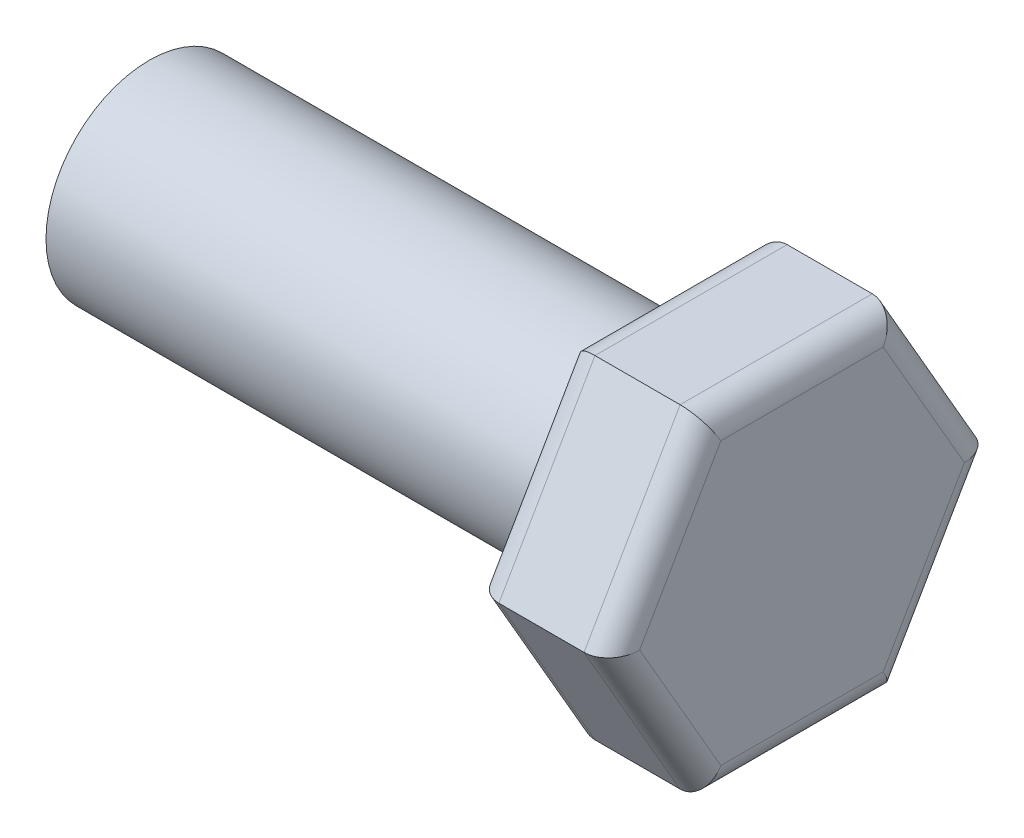
ISO-10303-21;
HEADER;
FILE_DESCRIPTION(('STEP AP214'),'2;1');
FILE_NAME('part.step','',(''),(''),'','','');
FILE_SCHEMA(('AUTOMOTIVE_DESIGN { 1 0 10303 214 1 1 1 1 }'));
ENDSEC;
DATA;
#1=APPLICATION_CONTEXT('core data for automotive mechanical design processes');
#2=APPLICATION_PROTOCOL_DEFINITION('international standard','automotive_design',2000,#1);
#3=PRODUCT_CONTEXT('',#1,'mechanical');
#4=PRODUCT('Part','Part','',(#3));
#5=PRODUCT_RELATED_PRODUCT_CATEGORY('part','',(#4));
#6=PRODUCT_DEFINITION_FORMATION('','',#4);
#7=PRODUCT_DEFINITION_CONTEXT('part definition',#1,'design');
#8=PRODUCT_DEFINITION('design','',#6,#7);
#9=PRODUCT_DEFINITION_SHAPE('','',#8);
#10=(LENGTH_UNIT() NAMED_UNIT(*) SI_UNIT(.MILLI.,.METRE.));
#11=(NAMED_UNIT(*) PLANE_ANGLE_UNIT() SI_UNIT($,.RADIAN.));
#12=(NAMED_UNIT(*) SI_UNIT($,.STERADIAN.) SOLID_ANGLE_UNIT());
#13=UNCERTAINTY_MEASURE_WITH_UNIT(LENGTH_MEASURE(1.E-05),#10,'distance_accuracy_value','');
#14=(GEOMETRIC_REPRESENTATION_CONTEXT(3) GLOBAL_UNCERTAINTY_ASSIGNED_CONTEXT((#13)) GLOBAL_UNIT_ASSIGNED_CONTEXT((#10,
#11,#12)) REPRESENTATION_CONTEXT('',''));
#15=CARTESIAN_POINT('',(0.,0.,0.));
#16=DIRECTION('',(0.,0.,1.));
#17=DIRECTION('',(1.,0.,0.));
#18=AXIS2_PLACEMENT_3D('',#15,#16,#17);
#19=CARTESIAN_POINT('',(5.3,6.45,-3.72390923627309));
#20=DIRECTION('',(0.,-1.,0.));
#21=DIRECTION('',(0.,0.,-1.));
#22=AXIS2_PLACEMENT_3D('',#19,#20,#21);
#23=PLANE('',#22);
#24=DIRECTION('',(-1.,0.,0.));
#25=VECTOR('',#24,1.);
#26=CARTESIAN_POINT('',(5.3,6.45,-3.72390923627309));
#27=LINE('',#26,#25);
#28=CARTESIAN_POINT('',(4.3,6.45,-3.72390923627309));
#29=VERTEX_POINT('',#28);
#30=CARTESIAN_POINT('',(1.,6.45,-3.72390923627309));
#31=VERTEX_POINT('',#30);
#32=EDGE_CURVE('E307',#29,#31,#27,.T.);
#33=ORIENTED_EDGE('',*,*,#32,.T.);
#34=DIRECTION('',(0.,0.,1.));
#35=VECTOR('',#34,1.);
#36=CARTESIAN_POINT('',(1.,6.45,-3.72390923627309));
#37=LINE('',#36,#35);
#38=CARTESIAN_POINT('',(1.,6.45,3.72390923627309));
#39=VERTEX_POINT('',#38);
#40=EDGE_CURVE('E179',#31,#39,#37,.T.);
#41=ORIENTED_EDGE('',*,*,#40,.T.);
#42=DIRECTION('',(-1.,0.,0.));
#43=VECTOR('',#42,1.);
#44=CARTESIAN_POINT('',(5.3,6.45,3.72390923627309));
#45=LINE('',#44,#43);
#46=CARTESIAN_POINT('',(4.3,6.45,3.72390923627309));
#47=VERTEX_POINT('',#46);
#48=EDGE_CURVE('E162',#47,#39,#45,.T.);
#49=ORIENTED_EDGE('',*,*,#48,.F.);
#50=DIRECTION('',(0.,0.,1.));
#51=VECTOR('',#50,1.);
#52=CARTESIAN_POINT('',(4.3,6.45,-3.72390923627309));
#53=LINE('',#52,#51);
#54=EDGE_CURVE('E176',#47,#29,#53,.F.);
#55=ORIENTED_EDGE('',*,*,#54,.T.);
#56=EDGE_LOOP('',(#33,#41,#49,#55));
#57=FACE_BOUND('',#56,.T.);
#58=ADVANCED_FACE('F44',(#57),#23,.F.);
#59=CARTESIAN_POINT('',(5.3,6.45,3.72390923627309));
#60=DIRECTION('',(0.,-0.5,-0.866025403784439));
#61=DIRECTION('',(0.,0.866025403784439,-0.5));
#62=AXIS2_PLACEMENT_3D('',#59,#60,#61);
#63=PLANE('',#62);
#64=ORIENTED_EDGE('',*,*,#48,.T.);
#65=DIRECTION('',(0.,-0.866025403784439,0.5));
#66=VECTOR('',#65,1.);
#67=CARTESIAN_POINT('',(1.,6.45,3.72390923627309));
#68=LINE('',#67,#66);
#69=CARTESIAN_POINT('',(1.,0.,7.44781847254617));
#70=VERTEX_POINT('',#69);
#71=EDGE_CURVE('E169',#39,#70,#68,.T.);
#72=ORIENTED_EDGE('',*,*,#71,.T.);
#73=DIRECTION('',(-1.,0.,0.));
#74=VECTOR('',#73,1.);
#75=CARTESIAN_POINT('',(5.3,0.,7.44781847254617));
#76=LINE('',#75,#74);
#77=CARTESIAN_POINT('',(4.3,0.,7.44781847254617));
#78=VERTEX_POINT('',#77);
#79=EDGE_CURVE('E164',#78,#70,#76,.T.);
#80=ORIENTED_EDGE('',*,*,#79,.F.);
#81=DIRECTION('',(0.,-0.866025403784439,0.5));
#82=VECTOR('',#81,1.);
#83=CARTESIAN_POINT('',(4.3,6.45,3.72390923627309));
#84=LINE('',#83,#82);
#85=EDGE_CURVE('E159',#78,#47,#84,.F.);
#86=ORIENTED_EDGE('',*,*,#85,.T.);
#87=EDGE_LOOP('',(#64,#72,#80,#86));
#88=FACE_BOUND('',#87,.T.);
#89=ADVANCED_FACE('F161',(#88),#63,.F.);
#90=CARTESIAN_POINT('',(5.3,0.,7.44781847254617));
#91=DIRECTION('',(0.,0.5,-0.866025403784439));
#92=DIRECTION('',(0.,0.866025403784439,0.5));
#93=AXIS2_PLACEMENT_3D('',#90,#91,#92);
#94=PLANE('',#93);
#95=ORIENTED_EDGE('',*,*,#79,.T.);
#96=DIRECTION('',(0.,-0.866025403784439,-0.5));
#97=VECTOR('',#96,1.);
#98=CARTESIAN_POINT('',(1.,0.,7.44781847254617));
#99=LINE('',#98,#97);
#100=CARTESIAN_POINT('',(1.,-6.45,3.72390923627308));
#101=VERTEX_POINT('',#100);
#102=EDGE_CURVE('E266',#70,#101,#99,.T.);
#103=ORIENTED_EDGE('',*,*,#102,.T.);
#104=DIRECTION('',(-1.,0.,0.));
#105=VECTOR('',#104,1.);
#106=CARTESIAN_POINT('',(5.3,-6.45,3.72390923627308));
#107=LINE('',#106,#105);
#108=CARTESIAN_POINT('',(4.3,-6.45,3.72390923627308));
#109=VERTEX_POINT('',#108);
#110=EDGE_CURVE('E295',#109,#101,#107,.T.);
#111=ORIENTED_EDGE('',*,*,#110,.F.);
#112=DIRECTION('',(0.,-0.866025403784439,-0.5));
#113=VECTOR('',#112,1.);
#114=CARTESIAN_POINT('',(4.3,0.,7.44781847254617));
#115=LINE('',#114,#113);
#116=EDGE_CURVE('E269',#109,#78,#115,.F.);
#117=ORIENTED_EDGE('',*,*,#116,.T.);
#118=EDGE_LOOP('',(#95,#103,#111,#117));
#119=FACE_BOUND('',#118,.T.);
#120=ADVANCED_FACE('F339',(#119),#94,.F.);
#121=CARTESIAN_POINT('',(5.3,-6.45,3.72390923627308));
#122=DIRECTION('',(0.,1.,0.));
#123=DIRECTION('',(0.,0.,1.));
#124=AXIS2_PLACEMENT_3D('',#121,#122,#123);
#125=PLANE('',#124);
#126=ORIENTED_EDGE('',*,*,#110,.T.);
#127=DIRECTION('',(0.,0.,-1.));
#128=VECTOR('',#127,1.);
#129=CARTESIAN_POINT('',(1.,-6.45,3.72390923627308));
#130=LINE('',#129,#128);
#131=CARTESIAN_POINT('',(1.,-6.45,-3.72390923627309));
#132=VERTEX_POINT('',#131);
#133=EDGE_CURVE('E259',#101,#132,#130,.T.);
#134=ORIENTED_EDGE('',*,*,#133,.T.);
#135=DIRECTION('',(-1.,0.,0.));
#136=VECTOR('',#135,1.);
#137=CARTESIAN_POINT('',(5.3,-6.45,-3.72390923627309));
#138=LINE('',#137,#136);
#139=CARTESIAN_POINT('',(4.3,-6.45,-3.72390923627309));
#140=VERTEX_POINT('',#139);
#141=EDGE_CURVE('E299',#140,#132,#138,.T.);
#142=ORIENTED_EDGE('',*,*,#141,.F.);
#143=DIRECTION('',(0.,0.,-1.));
#144=VECTOR('',#143,1.);
#145=CARTESIAN_POINT('',(4.3,-6.45,3.72390923627308));
#146=LINE('',#145,#144);
#147=EDGE_CURVE('E262',#140,#109,#146,.F.);
#148=ORIENTED_EDGE('',*,*,#147,.T.);
#149=EDGE_LOOP('',(#126,#134,#142,#148));
#150=FACE_BOUND('',#149,.T.);
#151=ADVANCED_FACE('F453',(#150),#125,.F.);
#152=CARTESIAN_POINT('',(5.3,-6.45,-3.72390923627309));
#153=DIRECTION('',(0.,0.5,0.866025403784439));
#154=DIRECTION('',(0.,-0.866025403784439,0.5));
#155=AXIS2_PLACEMENT_3D('',#152,#153,#154);
#156=PLANE('',#155);
#157=ORIENTED_EDGE('',*,*,#141,.T.);
#158=DIRECTION('',(0.,0.866025403784439,-0.5));
#159=VECTOR('',#158,1.);
#160=CARTESIAN_POINT('',(1.,-6.45,-3.72390923627309));
#161=LINE('',#160,#159);
#162=CARTESIAN_POINT('',(1.,0.,-7.44781847254617));
#163=VERTEX_POINT('',#162);
#164=EDGE_CURVE('E248',#132,#163,#161,.T.);
#165=ORIENTED_EDGE('',*,*,#164,.T.);
#166=DIRECTION('',(-1.,0.,0.));
#167=VECTOR('',#166,1.);
#168=CARTESIAN_POINT('',(5.3,0.,-7.44781847254617));
#169=LINE('',#168,#167);
#170=CARTESIAN_POINT('',(4.3,0.,-7.44781847254617));
#171=VERTEX_POINT('',#170);
#172=EDGE_CURVE('E303',#171,#163,#169,.T.);
#173=ORIENTED_EDGE('',*,*,#172,.F.);
#174=DIRECTION('',(0.,0.866025403784439,-0.5));
#175=VECTOR('',#174,1.);
#176=CARTESIAN_POINT('',(4.3,-6.45,-3.72390923627309));
#177=LINE('',#176,#175);
#178=EDGE_CURVE('E251',#171,#140,#177,.F.);
#179=ORIENTED_EDGE('',*,*,#178,.T.);
#180=EDGE_LOOP('',(#157,#165,#173,#179));
#181=FACE_BOUND('',#180,.T.);
#182=ADVANCED_FACE('F443',(#181),#156,.F.);
#183=CARTESIAN_POINT('',(5.3,0.,-7.44781847254617));
#184=DIRECTION('',(0.,-0.5,0.866025403784439));
#185=DIRECTION('',(0.,-0.866025403784439,-0.5));
#186=AXIS2_PLACEMENT_3D('',#183,#184,#185);
#187=PLANE('',#186);
#188=ORIENTED_EDGE('',*,*,#172,.T.);
#189=DIRECTION('',(0.,0.866025403784439,0.5));
#190=VECTOR('',#189,1.);
#191=CARTESIAN_POINT('',(1.,0.,-7.44781847254617));
#192=LINE('',#191,#190);
#193=EDGE_CURVE('E254',#163,#31,#192,.T.);
#194=ORIENTED_EDGE('',*,*,#193,.T.);
#195=ORIENTED_EDGE('',*,*,#32,.F.);
#196=DIRECTION('',(0.,0.866025403784439,0.5));
#197=VECTOR('',#196,1.);
#198=CARTESIAN_POINT('',(4.3,0.,-7.44781847254617));
#199=LINE('',#198,#197);
#200=EDGE_CURVE('E257',#29,#171,#199,.F.);
#201=ORIENTED_EDGE('',*,*,#200,.T.);
#202=EDGE_LOOP('',(#188,#194,#195,#201));
#203=FACE_BOUND('',#202,.T.);
#204=ADVANCED_FACE('F433',(#203),#187,.F.);
#205=CARTESIAN_POINT('',(5.3,0.,0.));
#206=DIRECTION('',(1.,0.,0.));
#207=DIRECTION('',(0.,0.,-1.));
#208=AXIS2_PLACEMENT_3D('',#205,#206,#207);
#209=PLANE('',#208);
#210=DIRECTION('',(0.,-0.866025403784439,-0.5));
#211=VECTOR('',#210,1.);
#212=CARTESIAN_POINT('',(5.3,-5.95,2.85788383248864));
#213=LINE('',#212,#211);
#214=CARTESIAN_POINT('',(5.3,0.,6.29311793416692));
#215=VERTEX_POINT('',#214);
#216=CARTESIAN_POINT('',(5.3,-5.45,3.14655896708346));
#217=VERTEX_POINT('',#216);
#218=EDGE_CURVE('E54',#215,#217,#213,.T.);
#219=ORIENTED_EDGE('',*,*,#218,.T.);
#220=DIRECTION('',(0.,0.,-1.));
#221=VECTOR('',#220,1.);
#222=CARTESIAN_POINT('',(5.3,-5.45,-3.72390923627309));
#223=LINE('',#222,#221);
#224=CARTESIAN_POINT('',(5.3,-5.45,-3.14655896708346));
#225=VERTEX_POINT('',#224);
#226=EDGE_CURVE('E11',#217,#225,#223,.T.);
#227=ORIENTED_EDGE('',*,*,#226,.T.);
#228=DIRECTION('',(0.,0.866025403784439,-0.5));
#229=VECTOR('',#228,1.);
#230=CARTESIAN_POINT('',(5.3,0.500000000000003,-6.58179306876173));
#231=LINE('',#230,#229);
#232=CARTESIAN_POINT('',(5.3,0.,-6.29311793416692));
#233=VERTEX_POINT('',#232);
#234=EDGE_CURVE('E245',#225,#233,#231,.T.);
#235=ORIENTED_EDGE('',*,*,#234,.T.);
#236=DIRECTION('',(0.,0.866025403784439,0.5));
#237=VECTOR('',#236,1.);
#238=CARTESIAN_POINT('',(5.3,5.95,-2.85788383248865));
#239=LINE('',#238,#237);
#240=CARTESIAN_POINT('',(5.3,5.45,-3.14655896708346));
#241=VERTEX_POINT('',#240);
#242=EDGE_CURVE('E243',#233,#241,#239,.T.);
#243=ORIENTED_EDGE('',*,*,#242,.T.);
#244=DIRECTION('',(0.,0.,1.));
#245=VECTOR('',#244,1.);
#246=CARTESIAN_POINT('',(5.3,5.45,3.72390923627309));
#247=LINE('',#246,#245);
#248=CARTESIAN_POINT('',(5.3,5.45,3.14655896708346));
#249=VERTEX_POINT('',#248);
#250=EDGE_CURVE('E240',#241,#249,#247,.T.);
#251=ORIENTED_EDGE('',*,*,#250,.T.);
#252=DIRECTION('',(0.,-0.866025403784439,0.5));
#253=VECTOR('',#252,1.);
#254=CARTESIAN_POINT('',(5.3,-0.500000000000003,6.58179306876173));
#255=LINE('',#254,#253);
#256=EDGE_CURVE('E71',#249,#215,#255,.T.);
#257=ORIENTED_EDGE('',*,*,#256,.T.);
#258=EDGE_LOOP('',(#219,#227,#235,#243,#251,#257));
#259=FACE_BOUND('',#258,.T.);
#260=ADVANCED_FACE('F420',(#259),#209,.T.);
#261=CARTESIAN_POINT('',(0.,0.,0.));
#262=DIRECTION('',(1.,0.,0.));
#263=DIRECTION('',(0.,0.,-1.));
#264=AXIS2_PLACEMENT_3D('',#261,#262,#263);
#265=PLANE('',#264);
#266=DIRECTION('',(0.,-0.866025403784439,0.5));
#267=VECTOR('',#266,1.);
#268=CARTESIAN_POINT('',(0.,2.725,4.71983845062519));
#269=LINE('',#268,#267);
#270=CARTESIAN_POINT('',(0.,0.,6.29311793416692));
#271=VERTEX_POINT('',#270);
#272=CARTESIAN_POINT('',(0.,5.45,3.14655896708346));
#273=VERTEX_POINT('',#272);
#274=EDGE_CURVE('E276',#271,#273,#269,.F.);
#275=ORIENTED_EDGE('',*,*,#274,.T.);
#276=DIRECTION('',(0.,0.,1.));
#277=VECTOR('',#276,1.);
#278=CARTESIAN_POINT('',(0.,5.45,0.));
#279=LINE('',#278,#277);
#280=CARTESIAN_POINT('',(0.,5.45,-3.14655896708346));
#281=VERTEX_POINT('',#280);
#282=EDGE_CURVE('E170',#273,#281,#279,.F.);
#283=ORIENTED_EDGE('',*,*,#282,.T.);
#284=DIRECTION('',(0.,0.866025403784439,0.5));
#285=VECTOR('',#284,1.);
#286=CARTESIAN_POINT('',(0.,2.725,-4.71983845062519));
#287=LINE('',#286,#285);
#288=CARTESIAN_POINT('',(0.,0.,-6.29311793416692));
#289=VERTEX_POINT('',#288);
#290=EDGE_CURVE('E285',#281,#289,#287,.F.);
#291=ORIENTED_EDGE('',*,*,#290,.T.);
#292=DIRECTION('',(0.,0.866025403784439,-0.5));
#293=VECTOR('',#292,1.);
#294=CARTESIAN_POINT('',(0.,-2.725,-4.71983845062519));
#295=LINE('',#294,#293);
#296=CARTESIAN_POINT('',(0.,-5.45,-3.14655896708346));
#297=VERTEX_POINT('',#296);
#298=EDGE_CURVE('E288',#289,#297,#295,.F.);
#299=ORIENTED_EDGE('',*,*,#298,.T.);
#300=DIRECTION('',(0.,0.,-1.));
#301=VECTOR('',#300,1.);
#302=CARTESIAN_POINT('',(0.,-5.45,0.));
#303=LINE('',#302,#301);
#304=CARTESIAN_POINT('',(0.,-5.45,3.14655896708346));
#305=VERTEX_POINT('',#304);
#306=EDGE_CURVE('E282',#297,#305,#303,.F.);
#307=ORIENTED_EDGE('',*,*,#306,.T.);
#308=DIRECTION('',(0.,-0.866025403784439,-0.5));
#309=VECTOR('',#308,1.);
#310=CARTESIAN_POINT('',(0.,-2.725,4.71983845062519));
#311=LINE('',#310,#309);
#312=EDGE_CURVE('E279',#305,#271,#311,.F.);
#313=ORIENTED_EDGE('',*,*,#312,.T.);
#314=EDGE_LOOP('',(#275,#283,#291,#299,#307,#313));
#315=FACE_BOUND('',#314,.T.);
#316=CARTESIAN_POINT('',(0.,0.,0.));
#317=DIRECTION('',(1.,0.,0.));
#318=DIRECTION('',(0.,0.,-1.));
#319=AXIS2_PLACEMENT_3D('',#316,#317,#318);
#320=CIRCLE('',#319,4.);
#321=CARTESIAN_POINT('',(0.,0.,-4.));
#322=VERTEX_POINT('',#321);
#323=EDGE_CURVE('E221',#322,#322,#320,.T.);
#324=ORIENTED_EDGE('',*,*,#323,.T.);
#325=EDGE_LOOP('',(#324));
#326=FACE_BOUND('',#325,.T.);
#327=ADVANCED_FACE('F332',(#315,#326),#265,.F.);
#328=CARTESIAN_POINT('',(-20.,0.,0.));
#329=DIRECTION('',(1.,0.,0.));
#330=DIRECTION('',(0.,0.,-1.));
#331=AXIS2_PLACEMENT_3D('',#328,#329,#330);
#332=CYLINDRICAL_SURFACE('',#331,4.);
#333=CARTESIAN_POINT('',(-20.,0.,0.));
#334=DIRECTION('',(1.,0.,0.));
#335=DIRECTION('',(0.,0.,-1.));
#336=AXIS2_PLACEMENT_3D('',#333,#334,#335);
#337=CIRCLE('',#336,4.);
#338=CARTESIAN_POINT('',(-20.,0.,-4.));
#339=VERTEX_POINT('',#338);
#340=EDGE_CURVE('E310',#339,#339,#337,.T.);
#341=ORIENTED_EDGE('',*,*,#340,.T.);
#342=EDGE_LOOP('',(#341));
#343=FACE_BOUND('',#342,.T.);
#344=ORIENTED_EDGE('',*,*,#323,.F.);
#345=EDGE_LOOP('',(#344));
#346=FACE_BOUND('',#345,.T.);
#347=ADVANCED_FACE('F318',(#343,#346),#332,.T.);
#348=CARTESIAN_POINT('',(-20.,0.,0.));
#349=DIRECTION('',(1.,0.,0.));
#350=DIRECTION('',(0.,0.,-1.));
#351=AXIS2_PLACEMENT_3D('',#348,#349,#350);
#352=PLANE('',#351);
#353=ORIENTED_EDGE('',*,*,#340,.F.);
#354=EDGE_LOOP('',(#353));
#355=FACE_BOUND('',#354,.T.);
#356=ADVANCED_FACE('F321',(#355),#352,.F.);
#357=CARTESIAN_POINT('',(1.,-5.45,3.72390923627308));
#358=DIRECTION('',(0.,0.,-1.));
#359=DIRECTION('',(0.,1.,0.));
#360=AXIS2_PLACEMENT_3D('',#357,#358,#359);
#361=CYLINDRICAL_SURFACE('',#360,1.);
#362=CARTESIAN_POINT('',(1.,-5.45,3.14655896708346));
#363=DIRECTION('',(0.,-0.5,-0.866025403784439));
#364=DIRECTION('',(0.,0.866025403784439,-0.5));
#365=AXIS2_PLACEMENT_3D('',#362,#363,#364);
#366=ELLIPSE('',#365,1.15470053837925,1.);
#367=EDGE_CURVE('E222',#305,#101,#366,.F.);
#368=ORIENTED_EDGE('',*,*,#367,.F.);
#369=ORIENTED_EDGE('',*,*,#306,.F.);
#370=CARTESIAN_POINT('',(1.,-5.45,-3.14655896708346));
#371=DIRECTION('',(0.,0.5,-0.866025403784438));
#372=DIRECTION('',(0.,0.866025403784438,0.5));
#373=AXIS2_PLACEMENT_3D('',#370,#371,#372);
#374=ELLIPSE('',#373,1.15470053837925,1.);
#375=EDGE_CURVE('E217',#132,#297,#374,.T.);
#376=ORIENTED_EDGE('',*,*,#375,.F.);
#377=ORIENTED_EDGE('',*,*,#133,.F.);
#378=EDGE_LOOP('',(#368,#369,#376,#377));
#379=FACE_BOUND('',#378,.T.);
#380=ADVANCED_FACE('F323',(#379),#361,.T.);
#381=CARTESIAN_POINT('',(1.,-5.95,-2.85788383248865));
#382=DIRECTION('',(0.,0.866025403784439,-0.5));
#383=DIRECTION('',(0.,0.5,0.866025403784439));
#384=AXIS2_PLACEMENT_3D('',#381,#382,#383);
#385=CYLINDRICAL_SURFACE('',#384,1.);
#386=ORIENTED_EDGE('',*,*,#375,.T.);
#387=ORIENTED_EDGE('',*,*,#298,.F.);
#388=CARTESIAN_POINT('',(1.,0.,-6.29311793416692));
#389=DIRECTION('',(0.,1.,0.));
#390=DIRECTION('',(0.,0.,-1.));
#391=AXIS2_PLACEMENT_3D('',#388,#389,#390);
#392=ELLIPSE('',#391,1.15470053837925,1.);
#393=EDGE_CURVE('E226',#163,#289,#392,.T.);
#394=ORIENTED_EDGE('',*,*,#393,.F.);
#395=ORIENTED_EDGE('',*,*,#164,.F.);
#396=EDGE_LOOP('',(#386,#387,#394,#395));
#397=FACE_BOUND('',#396,.T.);
#398=ADVANCED_FACE('F329',(#397),#385,.T.);
#399=CARTESIAN_POINT('',(1.,0.499999999999997,6.58179306876173));
#400=DIRECTION('',(0.,-0.866025403784439,-0.5));
#401=DIRECTION('',(0.,0.5,-0.866025403784439));
#402=AXIS2_PLACEMENT_3D('',#399,#400,#401);
#403=CYLINDRICAL_SURFACE('',#402,1.);
#404=ORIENTED_EDGE('',*,*,#367,.T.);
#405=ORIENTED_EDGE('',*,*,#102,.F.);
#406=CARTESIAN_POINT('',(1.,0.,6.29311793416692));
#407=DIRECTION('',(0.,-1.,0.));
#408=DIRECTION('',(0.,0.,-1.));
#409=AXIS2_PLACEMENT_3D('',#406,#407,#408);
#410=ELLIPSE('',#409,1.15470053837925,1.);
#411=EDGE_CURVE('E230',#271,#70,#410,.F.);
#412=ORIENTED_EDGE('',*,*,#411,.F.);
#413=ORIENTED_EDGE('',*,*,#312,.F.);
#414=EDGE_LOOP('',(#404,#405,#412,#413));
#415=FACE_BOUND('',#414,.T.);
#416=ADVANCED_FACE('F354',(#415),#403,.T.);
#417=CARTESIAN_POINT('',(1.,-0.499999999999996,-6.58179306876173));
#418=DIRECTION('',(0.,0.866025403784439,0.5));
#419=DIRECTION('',(0.,-0.5,0.866025403784439));
#420=AXIS2_PLACEMENT_3D('',#417,#418,#419);
#421=CYLINDRICAL_SURFACE('',#420,1.);
#422=ORIENTED_EDGE('',*,*,#393,.T.);
#423=ORIENTED_EDGE('',*,*,#290,.F.);
#424=CARTESIAN_POINT('',(1.,5.45,-3.14655896708346));
#425=DIRECTION('',(0.,0.5,0.866025403784439));
#426=DIRECTION('',(0.,0.866025403784439,-0.5));
#427=AXIS2_PLACEMENT_3D('',#424,#425,#426);
#428=ELLIPSE('',#427,1.15470053837925,1.);
#429=EDGE_CURVE('E196',#31,#281,#428,.T.);
#430=ORIENTED_EDGE('',*,*,#429,.F.);
#431=ORIENTED_EDGE('',*,*,#193,.F.);
#432=EDGE_LOOP('',(#422,#423,#430,#431));
#433=FACE_BOUND('',#432,.T.);
#434=ADVANCED_FACE('F350',(#433),#421,.T.);
#435=CARTESIAN_POINT('',(1.,5.95,2.85788383248865));
#436=DIRECTION('',(0.,-0.866025403784439,0.5));
#437=DIRECTION('',(0.,-0.5,-0.866025403784439));
#438=AXIS2_PLACEMENT_3D('',#435,#436,#437);
#439=CYLINDRICAL_SURFACE('',#438,1.);
#440=ORIENTED_EDGE('',*,*,#411,.T.);
#441=ORIENTED_EDGE('',*,*,#71,.F.);
#442=CARTESIAN_POINT('',(1.,5.45,3.14655896708346));
#443=DIRECTION('',(0.,-0.5,0.866025403784438));
#444=DIRECTION('',(0.,-0.866025403784438,-0.5));
#445=AXIS2_PLACEMENT_3D('',#442,#443,#444);
#446=ELLIPSE('',#445,1.15470053837925,1.);
#447=EDGE_CURVE('E193',#273,#39,#446,.F.);
#448=ORIENTED_EDGE('',*,*,#447,.F.);
#449=ORIENTED_EDGE('',*,*,#274,.F.);
#450=EDGE_LOOP('',(#440,#441,#448,#449));
#451=FACE_BOUND('',#450,.T.);
#452=ADVANCED_FACE('F346',(#451),#439,.T.);
#453=CARTESIAN_POINT('',(1.,5.45,-3.72390923627309));
#454=DIRECTION('',(0.,0.,1.));
#455=DIRECTION('',(0.,-1.,0.));
#456=AXIS2_PLACEMENT_3D('',#453,#454,#455);
#457=CYLINDRICAL_SURFACE('',#456,1.);
#458=ORIENTED_EDGE('',*,*,#429,.T.);
#459=ORIENTED_EDGE('',*,*,#282,.F.);
#460=ORIENTED_EDGE('',*,*,#447,.T.);
#461=ORIENTED_EDGE('',*,*,#40,.F.);
#462=EDGE_LOOP('',(#458,#459,#460,#461));
#463=FACE_BOUND('',#462,.T.);
#464=ADVANCED_FACE('F343',(#463),#457,.T.);
#465=CARTESIAN_POINT('',(4.3,5.45,0.));
#466=DIRECTION('',(0.,0.,-1.));
#467=DIRECTION('',(0.,1.,0.));
#468=AXIS2_PLACEMENT_3D('',#465,#466,#467);
#469=CYLINDRICAL_SURFACE('',#468,1.);
#470=CARTESIAN_POINT('',(4.3,5.45,-3.14655896708346));
#471=DIRECTION('',(0.,-0.5,-0.866025403784439));
#472=DIRECTION('',(0.,-0.866025403784439,0.5));
#473=AXIS2_PLACEMENT_3D('',#470,#471,#472);
#474=ELLIPSE('',#473,1.15470053837925,1.);
#475=EDGE_CURVE('E187',#29,#241,#474,.T.);
#476=ORIENTED_EDGE('',*,*,#475,.F.);
#477=ORIENTED_EDGE('',*,*,#54,.F.);
#478=CARTESIAN_POINT('',(4.3,5.45,3.14655896708346));
#479=DIRECTION('',(0.,0.5,-0.866025403784438));
#480=DIRECTION('',(0.,-0.866025403784438,-0.5));
#481=AXIS2_PLACEMENT_3D('',#478,#479,#480);
#482=ELLIPSE('',#481,1.15470053837925,1.);
#483=EDGE_CURVE('E48',#249,#47,#482,.F.);
#484=ORIENTED_EDGE('',*,*,#483,.F.);
#485=ORIENTED_EDGE('',*,*,#250,.F.);
#486=EDGE_LOOP('',(#476,#477,#484,#485));
#487=FACE_BOUND('',#486,.T.);
#488=ADVANCED_FACE('F46',(#487),#469,.T.);
#489=CARTESIAN_POINT('',(4.3,2.725,4.71983845062519));
#490=DIRECTION('',(0.,0.866025403784439,-0.5));
#491=DIRECTION('',(0.,0.5,0.866025403784439));
#492=AXIS2_PLACEMENT_3D('',#489,#490,#491);
#493=CYLINDRICAL_SURFACE('',#492,1.);
#494=ORIENTED_EDGE('',*,*,#483,.T.);
#495=ORIENTED_EDGE('',*,*,#85,.F.);
#496=CARTESIAN_POINT('',(4.3,0.,6.29311793416692));
#497=DIRECTION('',(0.,1.,0.));
#498=DIRECTION('',(0.,0.,-1.));
#499=AXIS2_PLACEMENT_3D('',#496,#497,#498);
#500=ELLIPSE('',#499,1.15470053837925,1.);
#501=EDGE_CURVE('E199',#215,#78,#500,.F.);
#502=ORIENTED_EDGE('',*,*,#501,.F.);
#503=ORIENTED_EDGE('',*,*,#256,.F.);
#504=EDGE_LOOP('',(#494,#495,#502,#503));
#505=FACE_BOUND('',#504,.T.);
#506=ADVANCED_FACE('F191',(#505),#493,.T.);
#507=CARTESIAN_POINT('',(4.3,2.725,-4.71983845062519));
#508=DIRECTION('',(0.,-0.866025403784439,-0.5));
#509=DIRECTION('',(0.,0.5,-0.866025403784439));
#510=AXIS2_PLACEMENT_3D('',#507,#508,#509);
#511=CYLINDRICAL_SURFACE('',#510,1.);
#512=ORIENTED_EDGE('',*,*,#475,.T.);
#513=ORIENTED_EDGE('',*,*,#242,.F.);
#514=CARTESIAN_POINT('',(4.3,0.,-6.29311793416692));
#515=DIRECTION('',(0.,-1.,0.));
#516=DIRECTION('',(0.,0.,1.));
#517=AXIS2_PLACEMENT_3D('',#514,#515,#516);
#518=ELLIPSE('',#517,1.15470053837925,1.);
#519=EDGE_CURVE('E205',#171,#233,#518,.T.);
#520=ORIENTED_EDGE('',*,*,#519,.F.);
#521=ORIENTED_EDGE('',*,*,#200,.F.);
#522=EDGE_LOOP('',(#512,#513,#520,#521));
#523=FACE_BOUND('',#522,.T.);
#524=ADVANCED_FACE('F373',(#523),#511,.T.);
#525=CARTESIAN_POINT('',(4.3,-2.725,4.71983845062519));
#526=DIRECTION('',(0.,0.866025403784439,0.5));
#527=DIRECTION('',(0.,-0.5,0.866025403784439));
#528=AXIS2_PLACEMENT_3D('',#525,#526,#527);
#529=CYLINDRICAL_SURFACE('',#528,1.);
#530=ORIENTED_EDGE('',*,*,#501,.T.);
#531=ORIENTED_EDGE('',*,*,#116,.F.);
#532=CARTESIAN_POINT('',(4.3,-5.45,3.14655896708346));
#533=DIRECTION('',(0.,0.5,0.866025403784439));
#534=DIRECTION('',(0.,0.866025403784439,-0.5));
#535=AXIS2_PLACEMENT_3D('',#532,#533,#534);
#536=ELLIPSE('',#535,1.15470053837925,1.);
#537=EDGE_CURVE('E211',#217,#109,#536,.F.);
#538=ORIENTED_EDGE('',*,*,#537,.F.);
#539=ORIENTED_EDGE('',*,*,#218,.F.);
#540=EDGE_LOOP('',(#530,#531,#538,#539));
#541=FACE_BOUND('',#540,.T.);
#542=ADVANCED_FACE('F369',(#541),#529,.T.);
#543=CARTESIAN_POINT('',(4.3,-2.725,-4.71983845062519));
#544=DIRECTION('',(0.,-0.866025403784439,0.5));
#545=DIRECTION('',(0.,-0.5,-0.866025403784439));
#546=AXIS2_PLACEMENT_3D('',#543,#544,#545);
#547=CYLINDRICAL_SURFACE('',#546,1.);
#548=ORIENTED_EDGE('',*,*,#519,.T.);
#549=ORIENTED_EDGE('',*,*,#234,.F.);
#550=CARTESIAN_POINT('',(4.3,-5.45,-3.14655896708346));
#551=DIRECTION('',(0.,-0.5,0.866025403784438));
#552=DIRECTION('',(0.,-0.866025403784438,-0.5));
#553=AXIS2_PLACEMENT_3D('',#550,#551,#552);
#554=ELLIPSE('',#553,1.15470053837925,1.);
#555=EDGE_CURVE('E214',#140,#225,#554,.T.);
#556=ORIENTED_EDGE('',*,*,#555,.F.);
#557=ORIENTED_EDGE('',*,*,#178,.F.);
#558=EDGE_LOOP('',(#548,#549,#556,#557));
#559=FACE_BOUND('',#558,.T.);
#560=ADVANCED_FACE('F365',(#559),#547,.T.);
#561=CARTESIAN_POINT('',(4.3,-5.45,0.));
#562=DIRECTION('',(0.,0.,1.));
#563=DIRECTION('',(0.,-1.,0.));
#564=AXIS2_PLACEMENT_3D('',#561,#562,#563);
#565=CYLINDRICAL_SURFACE('',#564,1.);
#566=ORIENTED_EDGE('',*,*,#537,.T.);
#567=ORIENTED_EDGE('',*,*,#147,.F.);
#568=ORIENTED_EDGE('',*,*,#555,.T.);
#569=ORIENTED_EDGE('',*,*,#226,.F.);
#570=EDGE_LOOP('',(#566,#567,#568,#569));
#571=FACE_BOUND('',#570,.T.);
#572=ADVANCED_FACE('F362',(#571),#565,.T.);
#573=CLOSED_SHELL('',(#58,#89,#120,#151,#182,#204,#260,#327,#347,#356,#380,#398,#416,#434,#452,
#464,#488,#506,#524,#542,#560,#572));
#574=MANIFOLD_SOLID_BREP('B2',#573);
#575=ADVANCED_BREP_SHAPE_REPRESENTATION('',(#18,#574),#14);
#576=SHAPE_DEFINITION_REPRESENTATION(#9,#575);
ENDSEC;
END-ISO-10303-21;
